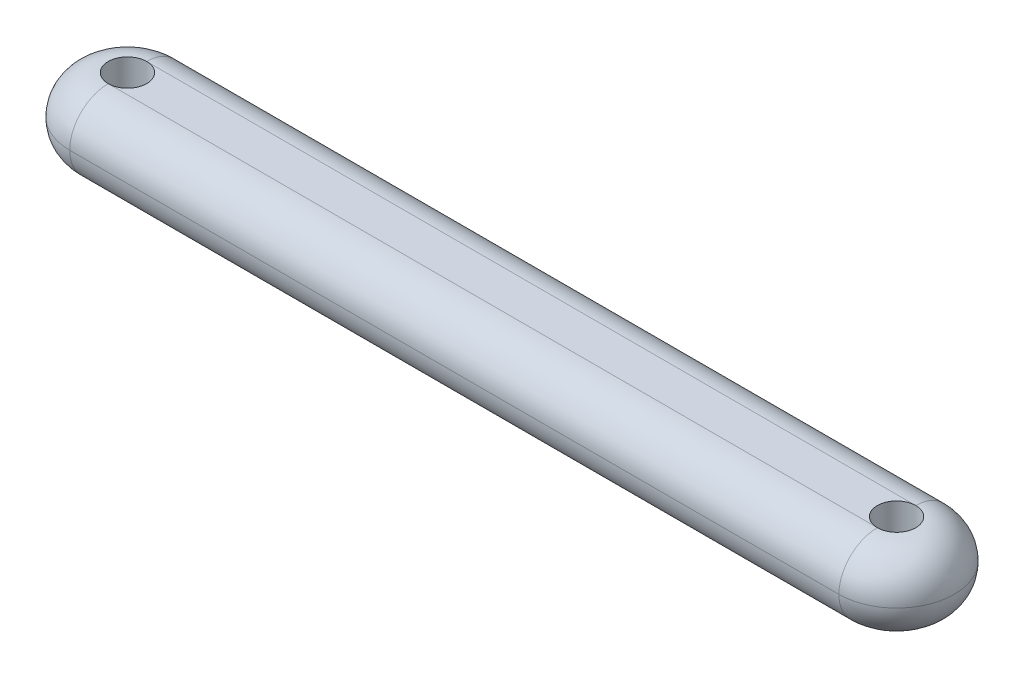
ISO-10303-21;
HEADER;
FILE_DESCRIPTION(('STEP AP214'),'2;1');
FILE_NAME('part.step','',(''),(''),'','','');
FILE_SCHEMA(('AUTOMOTIVE_DESIGN { 1 0 10303 214 1 1 1 1 }'));
ENDSEC;
DATA;
#1=APPLICATION_CONTEXT('core data for automotive mechanical design processes');
#2=APPLICATION_PROTOCOL_DEFINITION('international standard','automotive_design',2000,#1);
#3=PRODUCT_CONTEXT('',#1,'mechanical');
#4=PRODUCT('Part','Part','',(#3));
#5=PRODUCT_RELATED_PRODUCT_CATEGORY('part','',(#4));
#6=PRODUCT_DEFINITION_FORMATION('','',#4);
#7=PRODUCT_DEFINITION_CONTEXT('part definition',#1,'design');
#8=PRODUCT_DEFINITION('design','',#6,#7);
#9=PRODUCT_DEFINITION_SHAPE('','',#8);
#10=(LENGTH_UNIT() NAMED_UNIT(*) SI_UNIT(.MILLI.,.METRE.));
#11=(NAMED_UNIT(*) PLANE_ANGLE_UNIT() SI_UNIT($,.RADIAN.));
#12=(NAMED_UNIT(*) SI_UNIT($,.STERADIAN.) SOLID_ANGLE_UNIT());
#13=UNCERTAINTY_MEASURE_WITH_UNIT(LENGTH_MEASURE(1.E-05),#10,'distance_accuracy_value','');
#14=(GEOMETRIC_REPRESENTATION_CONTEXT(3) GLOBAL_UNCERTAINTY_ASSIGNED_CONTEXT((#13)) GLOBAL_UNIT_ASSIGNED_CONTEXT((#10,
#11,#12)) REPRESENTATION_CONTEXT('',''));
#15=CARTESIAN_POINT('',(0.,0.,0.));
#16=DIRECTION('',(0.,0.,1.));
#17=DIRECTION('',(1.,0.,0.));
#18=AXIS2_PLACEMENT_3D('',#15,#16,#17);
#19=CARTESIAN_POINT('',(0.,5.,0.));
#20=DIRECTION('',(0.,1.,0.));
#21=DIRECTION('',(0.,0.,1.));
#22=AXIS2_PLACEMENT_3D('',#19,#20,#21);
#23=PLANE('',#22);
#24=CARTESIAN_POINT('',(-100.,5.,0.));
#25=DIRECTION('',(0.,1.,0.));
#26=DIRECTION('',(0.,0.,1.));
#27=AXIS2_PLACEMENT_3D('',#24,#25,#26);
#28=CIRCLE('',#27,2.49999999999999);
#29=CARTESIAN_POINT('',(-100.,5.,2.49999999999999));
#30=VERTEX_POINT('',#29);
#31=CARTESIAN_POINT('',(-100.,5.,-2.5));
#32=VERTEX_POINT('',#31);
#33=EDGE_CURVE('E116',#30,#32,#28,.T.);
#34=ORIENTED_EDGE('',*,*,#33,.F.);
#35=DIRECTION('',(1.,0.,0.));
#36=VECTOR('',#35,1.);
#37=CARTESIAN_POINT('',(0.,5.,2.5));
#38=LINE('',#37,#36);
#39=CARTESIAN_POINT('',(0.,5.,2.5));
#40=VERTEX_POINT('',#39);
#41=EDGE_CURVE('E87',#30,#40,#38,.T.);
#42=ORIENTED_EDGE('',*,*,#41,.T.);
#43=CARTESIAN_POINT('',(0.,5.,0.));
#44=DIRECTION('',(0.,1.,0.));
#45=DIRECTION('',(0.,0.,1.));
#46=AXIS2_PLACEMENT_3D('',#43,#44,#45);
#47=CIRCLE('',#46,2.5);
#48=CARTESIAN_POINT('',(0.,5.,-2.5));
#49=VERTEX_POINT('',#48);
#50=EDGE_CURVE('E131',#49,#40,#47,.T.);
#51=ORIENTED_EDGE('',*,*,#50,.F.);
#52=DIRECTION('',(-1.,0.,0.));
#53=VECTOR('',#52,1.);
#54=CARTESIAN_POINT('',(-100.,5.,-2.5));
#55=LINE('',#54,#53);
#56=EDGE_CURVE('E136',#49,#32,#55,.T.);
#57=ORIENTED_EDGE('',*,*,#56,.T.);
#58=EDGE_LOOP('',(#34,#42,#51,#57));
#59=FACE_BOUND('',#58,.T.);
#60=ADVANCED_FACE('F41',(#59),#23,.T.);
#61=CARTESIAN_POINT('',(0.,-5.,0.));
#62=DIRECTION('',(0.,1.,0.));
#63=DIRECTION('',(0.,0.,1.));
#64=AXIS2_PLACEMENT_3D('',#61,#62,#63);
#65=PLANE('',#64);
#66=CARTESIAN_POINT('',(0.,-5.,0.));
#67=DIRECTION('',(0.,1.,0.));
#68=DIRECTION('',(0.,0.,1.));
#69=AXIS2_PLACEMENT_3D('',#66,#67,#68);
#70=CIRCLE('',#69,2.5);
#71=CARTESIAN_POINT('',(0.,-5.,-2.5));
#72=VERTEX_POINT('',#71);
#73=CARTESIAN_POINT('',(0.,-5.,2.5));
#74=VERTEX_POINT('',#73);
#75=EDGE_CURVE('E106',#72,#74,#70,.T.);
#76=ORIENTED_EDGE('',*,*,#75,.T.);
#77=DIRECTION('',(1.,0.,0.));
#78=VECTOR('',#77,1.);
#79=CARTESIAN_POINT('',(0.,-5.,2.5));
#80=LINE('',#79,#78);
#81=CARTESIAN_POINT('',(-100.,-5.,2.49999999999999));
#82=VERTEX_POINT('',#81);
#83=EDGE_CURVE('E11',#74,#82,#80,.F.);
#84=ORIENTED_EDGE('',*,*,#83,.T.);
#85=CARTESIAN_POINT('',(-100.,-5.,0.));
#86=DIRECTION('',(0.,1.,0.));
#87=DIRECTION('',(0.,0.,1.));
#88=AXIS2_PLACEMENT_3D('',#85,#86,#87);
#89=CIRCLE('',#88,2.49999999999999);
#90=CARTESIAN_POINT('',(-100.,-5.,-2.5));
#91=VERTEX_POINT('',#90);
#92=EDGE_CURVE('E108',#82,#91,#89,.T.);
#93=ORIENTED_EDGE('',*,*,#92,.T.);
#94=DIRECTION('',(-1.,0.,0.));
#95=VECTOR('',#94,1.);
#96=CARTESIAN_POINT('',(0.,-5.,-2.5));
#97=LINE('',#96,#95);
#98=EDGE_CURVE('E51',#91,#72,#97,.F.);
#99=ORIENTED_EDGE('',*,*,#98,.T.);
#100=EDGE_LOOP('',(#76,#84,#93,#99));
#101=FACE_BOUND('',#100,.T.);
#102=ADVANCED_FACE('F105',(#101),#65,.F.);
#103=CARTESIAN_POINT('',(0.,5.,0.));
#104=DIRECTION('',(0.,-1.,0.));
#105=DIRECTION('',(0.,0.,-1.));
#106=AXIS2_PLACEMENT_3D('',#103,#104,#105);
#107=CYLINDRICAL_SURFACE('',#106,2.5);
#108=EDGE_CURVE('E132',#40,#49,#47,.T.);
#109=ORIENTED_EDGE('',*,*,#108,.T.);
#110=ORIENTED_EDGE('',*,*,#50,.T.);
#111=EDGE_LOOP('',(#109,#110));
#112=FACE_BOUND('',#111,.T.);
#113=EDGE_CURVE('E115',#74,#72,#70,.T.);
#114=ORIENTED_EDGE('',*,*,#113,.F.);
#115=ORIENTED_EDGE('',*,*,#75,.F.);
#116=EDGE_LOOP('',(#114,#115));
#117=FACE_BOUND('',#116,.T.);
#118=ADVANCED_FACE('F113',(#112,#117),#107,.F.);
#119=CARTESIAN_POINT('',(-100.,5.,0.));
#120=DIRECTION('',(0.,-1.,0.));
#121=DIRECTION('',(0.,0.,-1.));
#122=AXIS2_PLACEMENT_3D('',#119,#120,#121);
#123=CYLINDRICAL_SURFACE('',#122,2.49999999999999);
#124=ORIENTED_EDGE('',*,*,#33,.T.);
#125=EDGE_CURVE('E162',#32,#30,#28,.T.);
#126=ORIENTED_EDGE('',*,*,#125,.T.);
#127=EDGE_LOOP('',(#124,#126));
#128=FACE_BOUND('',#127,.T.);
#129=ORIENTED_EDGE('',*,*,#92,.F.);
#130=EDGE_CURVE('E59',#91,#82,#89,.T.);
#131=ORIENTED_EDGE('',*,*,#130,.F.);
#132=EDGE_LOOP('',(#129,#131));
#133=FACE_BOUND('',#132,.T.);
#134=ADVANCED_FACE('F167',(#128,#133),#123,.F.);
#135=CARTESIAN_POINT('',(-100.,0.,0.));
#136=DIRECTION('',(0.,1.,0.));
#137=DIRECTION('',(0.,0.,1.));
#138=AXIS2_PLACEMENT_3D('',#135,#136,#137);
#139=DEGENERATE_TOROIDAL_SURFACE('',#138,2.5,5.,.T.);
#140=CARTESIAN_POINT('',(-100.,0.,-2.5));
#141=DIRECTION('',(1.,0.,0.));
#142=DIRECTION('',(0.,0.,-1.));
#143=AXIS2_PLACEMENT_3D('',#140,#141,#142);
#144=CIRCLE('',#143,5.);
#145=CARTESIAN_POINT('',(-100.,0.,-7.5));
#146=VERTEX_POINT('',#145);
#147=EDGE_CURVE('E126',#91,#146,#144,.T.);
#148=ORIENTED_EDGE('',*,*,#147,.F.);
#149=ORIENTED_EDGE('',*,*,#130,.T.);
#150=CARTESIAN_POINT('',(-100.,0.,2.5));
#151=DIRECTION('',(1.,0.,0.));
#152=DIRECTION('',(0.,0.,-1.));
#153=AXIS2_PLACEMENT_3D('',#150,#151,#152);
#154=CIRCLE('',#153,5.);
#155=CARTESIAN_POINT('',(-100.,0.,7.5));
#156=VERTEX_POINT('',#155);
#157=EDGE_CURVE('E45',#156,#82,#154,.T.);
#158=ORIENTED_EDGE('',*,*,#157,.F.);
#159=CARTESIAN_POINT('',(-100.,0.,0.));
#160=DIRECTION('',(0.,1.,0.));
#161=DIRECTION('',(0.,0.,1.));
#162=AXIS2_PLACEMENT_3D('',#159,#160,#161);
#163=CIRCLE('',#162,7.5);
#164=EDGE_CURVE('E76',#146,#156,#163,.T.);
#165=ORIENTED_EDGE('',*,*,#164,.F.);
#166=EDGE_LOOP('',(#148,#149,#158,#165));
#167=FACE_BOUND('',#166,.T.);
#168=ADVANCED_FACE('F43',(#167),#139,.T.);
#169=CARTESIAN_POINT('',(0.,0.,2.5));
#170=DIRECTION('',(1.,0.,0.));
#171=DIRECTION('',(0.,0.,-1.));
#172=AXIS2_PLACEMENT_3D('',#169,#170,#171);
#173=CYLINDRICAL_SURFACE('',#172,5.);
#174=ORIENTED_EDGE('',*,*,#157,.T.);
#175=ORIENTED_EDGE('',*,*,#83,.F.);
#176=CARTESIAN_POINT('',(0.,0.,2.5));
#177=DIRECTION('',(1.,0.,0.));
#178=DIRECTION('',(0.,0.,-1.));
#179=AXIS2_PLACEMENT_3D('',#176,#177,#178);
#180=CIRCLE('',#179,5.);
#181=CARTESIAN_POINT('',(0.,0.,7.5));
#182=VERTEX_POINT('',#181);
#183=EDGE_CURVE('E127',#182,#74,#180,.T.);
#184=ORIENTED_EDGE('',*,*,#183,.F.);
#185=DIRECTION('',(1.,0.,0.));
#186=VECTOR('',#185,1.);
#187=CARTESIAN_POINT('',(0.,0.,7.5));
#188=LINE('',#187,#186);
#189=EDGE_CURVE('E153',#156,#182,#188,.T.);
#190=ORIENTED_EDGE('',*,*,#189,.F.);
#191=EDGE_LOOP('',(#174,#175,#184,#190));
#192=FACE_BOUND('',#191,.T.);
#193=ADVANCED_FACE('F205',(#192),#173,.T.);
#194=CARTESIAN_POINT('',(-100.,0.,0.));
#195=DIRECTION('',(0.,1.,0.));
#196=DIRECTION('',(0.,0.,1.));
#197=AXIS2_PLACEMENT_3D('',#194,#195,#196);
#198=DEGENERATE_TOROIDAL_SURFACE('',#197,2.5,5.,.T.);
#199=CARTESIAN_POINT('',(-100.,0.,-2.5));
#200=DIRECTION('',(1.,0.,0.));
#201=DIRECTION('',(0.,0.,-1.));
#202=AXIS2_PLACEMENT_3D('',#199,#200,#201);
#203=CIRCLE('',#202,5.);
#204=EDGE_CURVE('E147',#146,#32,#203,.T.);
#205=ORIENTED_EDGE('',*,*,#204,.F.);
#206=ORIENTED_EDGE('',*,*,#164,.T.);
#207=CARTESIAN_POINT('',(-100.,0.,2.5));
#208=DIRECTION('',(1.,0.,0.));
#209=DIRECTION('',(0.,0.,-1.));
#210=AXIS2_PLACEMENT_3D('',#207,#208,#209);
#211=CIRCLE('',#210,5.);
#212=EDGE_CURVE('E150',#30,#156,#211,.T.);
#213=ORIENTED_EDGE('',*,*,#212,.F.);
#214=ORIENTED_EDGE('',*,*,#125,.F.);
#215=EDGE_LOOP('',(#205,#206,#213,#214));
#216=FACE_BOUND('',#215,.T.);
#217=ADVANCED_FACE('F169',(#216),#198,.T.);
#218=CARTESIAN_POINT('',(0.,0.,-2.5));
#219=DIRECTION('',(-1.,0.,0.));
#220=DIRECTION('',(0.,0.,1.));
#221=AXIS2_PLACEMENT_3D('',#218,#219,#220);
#222=CYLINDRICAL_SURFACE('',#221,5.);
#223=CARTESIAN_POINT('',(0.,0.,-2.5));
#224=DIRECTION('',(1.,0.,0.));
#225=DIRECTION('',(0.,0.,-1.));
#226=AXIS2_PLACEMENT_3D('',#223,#224,#225);
#227=CIRCLE('',#226,5.);
#228=CARTESIAN_POINT('',(0.,0.,-7.5));
#229=VERTEX_POINT('',#228);
#230=EDGE_CURVE('E119',#72,#229,#227,.T.);
#231=ORIENTED_EDGE('',*,*,#230,.F.);
#232=ORIENTED_EDGE('',*,*,#98,.F.);
#233=ORIENTED_EDGE('',*,*,#147,.T.);
#234=DIRECTION('',(-1.,0.,0.));
#235=VECTOR('',#234,1.);
#236=CARTESIAN_POINT('',(0.,0.,-7.5));
#237=LINE('',#236,#235);
#238=EDGE_CURVE('E122',#229,#146,#237,.T.);
#239=ORIENTED_EDGE('',*,*,#238,.F.);
#240=EDGE_LOOP('',(#231,#232,#233,#239));
#241=FACE_BOUND('',#240,.T.);
#242=ADVANCED_FACE('F120',(#241),#222,.T.);
#243=CARTESIAN_POINT('',(0.,0.,0.));
#244=DIRECTION('',(0.,1.,0.));
#245=DIRECTION('',(0.,0.,1.));
#246=AXIS2_PLACEMENT_3D('',#243,#244,#245);
#247=DEGENERATE_TOROIDAL_SURFACE('',#246,2.5,5.,.T.);
#248=ORIENTED_EDGE('',*,*,#113,.T.);
#249=ORIENTED_EDGE('',*,*,#230,.T.);
#250=CARTESIAN_POINT('',(0.,0.,0.));
#251=DIRECTION('',(0.,1.,0.));
#252=DIRECTION('',(0.,0.,1.));
#253=AXIS2_PLACEMENT_3D('',#250,#251,#252);
#254=CIRCLE('',#253,7.5);
#255=EDGE_CURVE('E144',#182,#229,#254,.T.);
#256=ORIENTED_EDGE('',*,*,#255,.F.);
#257=ORIENTED_EDGE('',*,*,#183,.T.);
#258=EDGE_LOOP('',(#248,#249,#256,#257));
#259=FACE_BOUND('',#258,.T.);
#260=ADVANCED_FACE('F129',(#259),#247,.T.);
#261=CARTESIAN_POINT('',(0.,0.,2.5));
#262=DIRECTION('',(-1.,0.,0.));
#263=DIRECTION('',(0.,0.,1.));
#264=AXIS2_PLACEMENT_3D('',#261,#262,#263);
#265=CYLINDRICAL_SURFACE('',#264,5.);
#266=ORIENTED_EDGE('',*,*,#212,.T.);
#267=ORIENTED_EDGE('',*,*,#189,.T.);
#268=CARTESIAN_POINT('',(0.,0.,2.5));
#269=DIRECTION('',(1.,0.,0.));
#270=DIRECTION('',(0.,0.,-1.));
#271=AXIS2_PLACEMENT_3D('',#268,#269,#270);
#272=CIRCLE('',#271,5.);
#273=EDGE_CURVE('E141',#40,#182,#272,.T.);
#274=ORIENTED_EDGE('',*,*,#273,.F.);
#275=ORIENTED_EDGE('',*,*,#41,.F.);
#276=EDGE_LOOP('',(#266,#267,#274,#275));
#277=FACE_BOUND('',#276,.T.);
#278=ADVANCED_FACE('F172',(#277),#265,.T.);
#279=CARTESIAN_POINT('',(0.,0.,-2.5));
#280=DIRECTION('',(1.,0.,0.));
#281=DIRECTION('',(0.,0.,-1.));
#282=AXIS2_PLACEMENT_3D('',#279,#280,#281);
#283=CYLINDRICAL_SURFACE('',#282,5.);
#284=ORIENTED_EDGE('',*,*,#204,.T.);
#285=ORIENTED_EDGE('',*,*,#56,.F.);
#286=CARTESIAN_POINT('',(0.,0.,-2.5));
#287=DIRECTION('',(1.,0.,0.));
#288=DIRECTION('',(0.,0.,-1.));
#289=AXIS2_PLACEMENT_3D('',#286,#287,#288);
#290=CIRCLE('',#289,5.);
#291=EDGE_CURVE('E139',#229,#49,#290,.T.);
#292=ORIENTED_EDGE('',*,*,#291,.F.);
#293=ORIENTED_EDGE('',*,*,#238,.T.);
#294=EDGE_LOOP('',(#284,#285,#292,#293));
#295=FACE_BOUND('',#294,.T.);
#296=ADVANCED_FACE('F194',(#295),#283,.T.);
#297=CARTESIAN_POINT('',(0.,0.,0.));
#298=DIRECTION('',(0.,1.,0.));
#299=DIRECTION('',(0.,0.,1.));
#300=AXIS2_PLACEMENT_3D('',#297,#298,#299);
#301=DEGENERATE_TOROIDAL_SURFACE('',#300,2.5,5.,.T.);
#302=ORIENTED_EDGE('',*,*,#273,.T.);
#303=ORIENTED_EDGE('',*,*,#255,.T.);
#304=ORIENTED_EDGE('',*,*,#291,.T.);
#305=ORIENTED_EDGE('',*,*,#108,.F.);
#306=EDGE_LOOP('',(#302,#303,#304,#305));
#307=FACE_BOUND('',#306,.T.);
#308=ADVANCED_FACE('F176',(#307),#301,.T.);
#309=CLOSED_SHELL('',(#60,#102,#118,#134,#168,#193,#217,#242,#260,#278,#296,#308));
#310=MANIFOLD_SOLID_BREP('B2',#309);
#311=ADVANCED_BREP_SHAPE_REPRESENTATION('',(#18,#310),#14);
#312=SHAPE_DEFINITION_REPRESENTATION(#9,#311);
ENDSEC;
END-ISO-10303-21;
